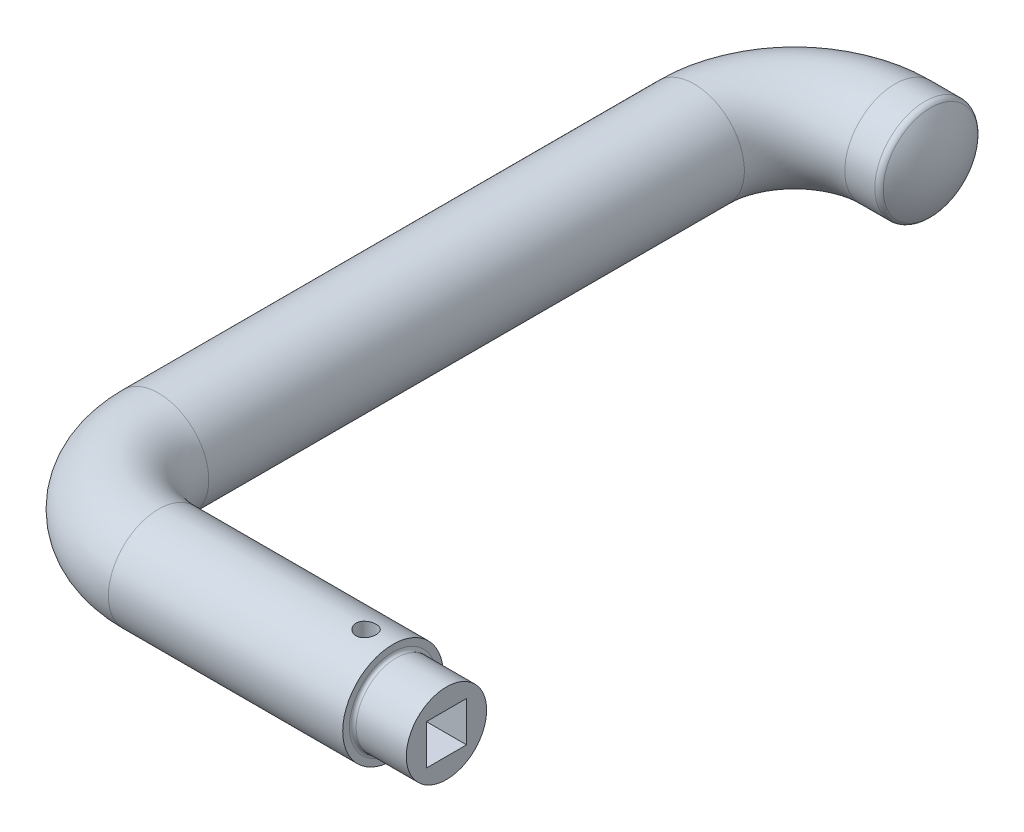
ISO-10303-21;
HEADER;
FILE_DESCRIPTION(('STEP AP214'),'2;1');
FILE_NAME('part.step','',(''),(''),'','','');
FILE_SCHEMA(('AUTOMOTIVE_DESIGN { 1 0 10303 214 1 1 1 1 }'));
ENDSEC;
DATA;
#1=APPLICATION_CONTEXT('core data for automotive mechanical design processes');
#2=APPLICATION_PROTOCOL_DEFINITION('international standard','automotive_design',2000,#1);
#3=PRODUCT_CONTEXT('',#1,'mechanical');
#4=PRODUCT('Part','Part','',(#3));
#5=PRODUCT_RELATED_PRODUCT_CATEGORY('part','',(#4));
#6=PRODUCT_DEFINITION_FORMATION('','',#4);
#7=PRODUCT_DEFINITION_CONTEXT('part definition',#1,'design');
#8=PRODUCT_DEFINITION('design','',#6,#7);
#9=PRODUCT_DEFINITION_SHAPE('','',#8);
#10=(LENGTH_UNIT() NAMED_UNIT(*) SI_UNIT(.MILLI.,.METRE.));
#11=(NAMED_UNIT(*) PLANE_ANGLE_UNIT() SI_UNIT($,.RADIAN.));
#12=(NAMED_UNIT(*) SI_UNIT($,.STERADIAN.) SOLID_ANGLE_UNIT());
#13=UNCERTAINTY_MEASURE_WITH_UNIT(LENGTH_MEASURE(1.E-05),#10,'distance_accuracy_value','');
#14=(GEOMETRIC_REPRESENTATION_CONTEXT(3) GLOBAL_UNCERTAINTY_ASSIGNED_CONTEXT((#13)) GLOBAL_UNIT_ASSIGNED_CONTEXT((#10,
#11,#12)) REPRESENTATION_CONTEXT('',''));
#15=CARTESIAN_POINT('',(0.,0.,0.));
#16=DIRECTION('',(0.,0.,1.));
#17=DIRECTION('',(1.,0.,0.));
#18=AXIS2_PLACEMENT_3D('',#15,#16,#17);
#19=CARTESIAN_POINT('',(0.,0.,0.));
#20=DIRECTION('',(-1.,0.,0.));
#21=DIRECTION('',(0.,0.,1.));
#22=AXIS2_PLACEMENT_3D('',#19,#20,#21);
#23=CYLINDRICAL_SURFACE('',#22,7.49999999999999);
#24=CARTESIAN_POINT('',(-26.9999999999999,0.,0.));
#25=DIRECTION('',(1.,0.,0.));
#26=DIRECTION('',(0.,0.,-1.));
#27=AXIS2_PLACEMENT_3D('',#24,#25,#26);
#28=CIRCLE('',#27,7.49999999999999);
#29=CARTESIAN_POINT('',(-26.9999999999998,0.,7.49999999999999));
#30=VERTEX_POINT('',#29);
#31=EDGE_CURVE('E138',#30,#30,#28,.T.);
#32=ORIENTED_EDGE('',*,*,#31,.T.);
#33=EDGE_LOOP('',(#32));
#34=FACE_BOUND('',#33,.T.);
#35=CARTESIAN_POINT('',(8.00000000000001,0.,0.));
#36=DIRECTION('',(-1.,0.,0.));
#37=DIRECTION('',(0.,0.,1.));
#38=AXIS2_PLACEMENT_3D('',#35,#36,#37);
#39=CIRCLE('',#38,7.49999999999999);
#40=CARTESIAN_POINT('',(8.00000000000001,0.,7.49999999999999));
#41=VERTEX_POINT('',#40);
#42=EDGE_CURVE('E117',#41,#41,#39,.T.);
#43=ORIENTED_EDGE('',*,*,#42,.T.);
#44=EDGE_LOOP('',(#43));
#45=FACE_BOUND('',#44,.T.);
#46=CARTESIAN_POINT('',(2.50000000000001,7.49999999999999,0.));
#47=CARTESIAN_POINT('',(2.50000306674753,7.49999846371306,0.0833653601889495));
#48=CARTESIAN_POINT('',(2.50697326445148,7.49859577767346,0.166769490302283));
#49=CARTESIAN_POINT('',(2.53464775017288,7.49313548434846,0.331220261533529));
#50=CARTESIAN_POINT('',(2.55536294920227,7.48907576790279,0.412264976312033));
#51=CARTESIAN_POINT('',(2.60986191043119,7.47875473917429,0.569595457894969));
#52=CARTESIAN_POINT('',(2.64363315526704,7.47249553615076,0.645885701899701));
#53=CARTESIAN_POINT('',(2.72324837126695,7.45845597052971,0.791711983296338));
#54=CARTESIAN_POINT('',(2.76909162341082,7.4506756985356,0.861248422613717));
#55=CARTESIAN_POINT('',(2.87220774143716,7.43433247994954,0.992540215972297));
#56=CARTESIAN_POINT('',(2.92961253308681,7.4257611825652,1.05419092673779));
#57=CARTESIAN_POINT('',(3.05393862458756,7.40886270678882,1.16705513491204));
#58=CARTESIAN_POINT('',(3.12086066700269,7.40053554750635,1.21826781715564));
#59=CARTESIAN_POINT('',(3.26307428951782,7.38498662718922,1.30924763002143));
#60=CARTESIAN_POINT('',(3.33843646569455,7.37777561047418,1.3489064082988));
#61=CARTESIAN_POINT('',(3.49492272850613,7.36539402087626,1.41495849987046));
#62=CARTESIAN_POINT('',(3.57604624501953,7.36022324642942,1.44135312365586));
#63=CARTESIAN_POINT('',(3.74062654586189,7.35259207878306,1.47978794982724));
#64=CARTESIAN_POINT('',(3.82403881621335,7.35009705160781,1.49201174693817));
#65=CARTESIAN_POINT('',(3.99176473204652,7.3479956259094,1.50232819158918));
#66=CARTESIAN_POINT('',(4.07607828448023,7.3483889320176,1.50042228407025));
#67=CARTESIAN_POINT('',(4.24187018203151,7.35198826722276,1.48268185965273));
#68=CARTESIAN_POINT('',(4.32337210844098,7.35515179288145,1.46705781036586));
#69=CARTESIAN_POINT('',(4.48257411499451,7.36386819240001,1.42265682693458));
#70=CARTESIAN_POINT('',(4.56027401337852,7.36942118036667,1.39387926465102));
#71=CARTESIAN_POINT('',(4.71027289255541,7.38233427750611,1.32378717551208));
#72=CARTESIAN_POINT('',(4.78253181935377,7.38970634720556,1.28238922684817));
#73=CARTESIAN_POINT('',(4.91915627495923,7.40541928159592,1.18829036185902));
#74=CARTESIAN_POINT('',(4.98352089527674,7.41376025757548,1.13558814653524));
#75=CARTESIAN_POINT('',(5.10374410368541,7.43065531862192,1.01924990184088));
#76=CARTESIAN_POINT('',(5.1594288517887,7.43921053816357,0.955434241818667));
#77=CARTESIAN_POINT('',(5.25933076945184,7.45543273071612,0.819277536093014));
#78=CARTESIAN_POINT('',(5.30354779194038,7.4630996923346,0.746936381069083));
#79=CARTESIAN_POINT('',(5.37929126383897,7.4767003524133,0.59558908031838));
#80=CARTESIAN_POINT('',(5.41079784046681,7.48263133272407,0.516572729377949));
#81=CARTESIAN_POINT('',(5.46004071105786,7.49207113481787,0.354223464672997));
#82=CARTESIAN_POINT('',(5.47777867311045,7.49558025000796,0.270891075108674));
#83=CARTESIAN_POINT('',(5.49873468069142,7.49974007800301,0.103769108440725));
#84=CARTESIAN_POINT('',(5.50219062931041,7.50043761978704,0.0200104924883638));
#85=CARTESIAN_POINT('',(5.49512521158674,7.49902577895153,-0.146887401289071));
#86=CARTESIAN_POINT('',(5.48460463097111,7.49691655412168,-0.23002671366569));
#87=CARTESIAN_POINT('',(5.45008243968408,7.49015748012026,-0.392558489919811));
#88=CARTESIAN_POINT('',(5.42620289725315,7.48553064606309,-0.471977922509854));
#89=CARTESIAN_POINT('',(5.36577402601629,7.47425328091548,-0.6256854412495));
#90=CARTESIAN_POINT('',(5.32922374798476,7.46760259821339,-0.699973142456309));
#91=CARTESIAN_POINT('',(5.24397626402304,7.45289867299941,-0.842311760529326));
#92=CARTESIAN_POINT('',(5.19513582844159,7.44482925655577,-0.910275190128281));
#93=CARTESIAN_POINT('',(5.08688621318909,7.42822102244823,-1.03712702867881));
#94=CARTESIAN_POINT('',(5.02747590040021,7.41968215452581,-1.09601446339614));
#95=CARTESIAN_POINT('',(4.89868997216332,7.40293955335447,-1.20396088616126));
#96=CARTESIAN_POINT('',(4.829176383668,7.39474290349956,-1.25285655367298));
#97=CARTESIAN_POINT('',(4.68278295796499,7.37976287694291,-1.33827813007681));
#98=CARTESIAN_POINT('',(4.60590341563968,7.37297944370013,-1.37480453388435));
#99=CARTESIAN_POINT('',(4.44734763077568,7.36165110876574,-1.43422776237294));
#100=CARTESIAN_POINT('',(4.36569873818453,7.35709462308279,-1.45719524968658));
#101=CARTESIAN_POINT('',(4.19959981976365,7.35071155188037,-1.48906297744079));
#102=CARTESIAN_POINT('',(4.11515016068599,7.34888461036666,-1.49796505233767));
#103=CARTESIAN_POINT('',(3.94748670318353,7.34818724447068,-1.5013813663012));
#104=CARTESIAN_POINT('',(3.86427827660949,7.34926378783951,-1.49615368210634));
#105=CARTESIAN_POINT('',(3.69995252514247,7.3541336022692,-1.47202845615009));
#106=CARTESIAN_POINT('',(3.6188351834578,7.35792685150753,-1.45313102419395));
#107=CARTESIAN_POINT('',(3.46115843313919,7.36777896328737,-1.40231785274843));
#108=CARTESIAN_POINT('',(3.38458845924639,7.37383231528245,-1.37043376007602));
#109=CARTESIAN_POINT('',(3.23784441889835,7.38752572461255,-1.29458196690241));
#110=CARTESIAN_POINT('',(3.1676708894123,7.3951659149834,-1.25061325316232));
#111=CARTESIAN_POINT('',(3.03442664177454,7.41133440784837,-1.15095887217962));
#112=CARTESIAN_POINT('',(2.97149685209862,7.41987559364548,-1.09508683085277));
#113=CARTESIAN_POINT('',(2.85582069170625,7.43679122807931,-0.973596553519711));
#114=CARTESIAN_POINT('',(2.8030766645241,7.44516563794776,-0.907976080730002));
#115=CARTESIAN_POINT('',(2.70874803408034,7.46090748581956,-0.76802644363237));
#116=CARTESIAN_POINT('',(2.66728599507997,7.46826346828869,-0.693613326644752));
#117=CARTESIAN_POINT('',(2.59752081610512,7.48102687627499,-0.538749541411098));
#118=CARTESIAN_POINT('',(2.56920581570127,7.48643605707923,-0.458304391294689));
#119=CARTESIAN_POINT('',(2.53202207793294,7.49364558893055,-0.314732233385669));
#120=CARTESIAN_POINT('',(2.52003520943837,7.49601454737677,-0.252422496020677));
#121=CARTESIAN_POINT('',(2.50402313146246,7.49919231209838,-0.1267492878151));
#122=CARTESIAN_POINT('',(2.49999766823536,7.50000116809732,-0.0633858506229287));
#123=CARTESIAN_POINT('',(2.50000000000001,7.49999999999999,0.));
#124=B_SPLINE_CURVE_WITH_KNOTS('',3,(#46,#47,#48,#49,#50,#51,#52,#53,#54,#55,#56,#57,#58,#59,
#60,#61,#62,#63,#64,#65,#66,#67,#68,#69,#70,#71,#72,#73,#74,#75,#76,#77,#78,#79,#80,#81,#82,#83,
#84,#85,#86,#87,#88,#89,#90,#91,#92,#93,#94,#95,#96,#97,#98,#99,#100,#101,#102,#103,#104,#105,
#106,#107,#108,#109,#110,#111,#112,#113,#114,#115,#116,#117,#118,#119,#120,#121,#122,#123),
.UNSPECIFIED.,.T.,.F.,(4,2,2,2,2,2,2,2,2,2,2,2,2,2,2,2,2,2,2,2,2,2,2,2,2,2,2,2,2,2,2,2,2,2,2,2,
2,2,4),(0.,0.249864195991888,0.499926976036984,0.749750602875512,0.999559353346294,
1.25239900516828,1.50525839512105,1.76041792508884,2.01555224047796,2.26734277655381,
2.51910756421838,2.76707590509417,3.01505608880595,3.26471235305389,3.51439732124506,
3.76857378737026,4.0227535130973,4.27732912281036,4.53187388547054,4.78216103514398,
5.03243411486801,5.28045680926085,5.52849808824033,5.77957599050038,6.03068082518895,
6.28560942868838,6.540527830852,6.79410571549084,7.04765052495622,7.29659583851552,
7.54553915238912,7.79387941879665,8.04224051372799,8.29482114358714,8.54745981799396,
8.80274245013455,9.05779433276278,9.24778162934841,9.43776287056494),.UNSPECIFIED.);
#125=CARTESIAN_POINT('',(2.50000000000001,7.49999999999999,0.));
#126=VERTEX_POINT('',#125);
#127=EDGE_CURVE('E98',#126,#126,#124,.T.);
#128=ORIENTED_EDGE('',*,*,#127,.F.);
#129=EDGE_LOOP('',(#128));
#130=FACE_BOUND('',#129,.T.);
#131=ADVANCED_FACE('F45',(#34,#45,#130),#23,.T.);
#132=CARTESIAN_POINT('',(-27.,0.,-15.));
#133=DIRECTION('',(0.,-1.,0.));
#134=DIRECTION('',(0.,0.,-1.));
#135=AXIS2_PLACEMENT_3D('',#132,#133,#134);
#136=TOROIDAL_SURFACE('',#135,15.,7.49999999999999);
#137=CARTESIAN_POINT('',(-42.,0.,-15.0000000000001));
#138=DIRECTION('',(0.,0.,1.));
#139=DIRECTION('',(1.,0.,0.));
#140=AXIS2_PLACEMENT_3D('',#137,#138,#139);
#141=CIRCLE('',#140,7.49999999999999);
#142=CARTESIAN_POINT('',(-49.5,0.,-15.0000000000002));
#143=VERTEX_POINT('',#142);
#144=EDGE_CURVE('E141',#143,#143,#141,.T.);
#145=CARTESIAN_POINT('',(-27.,0.,-15.));
#146=DIRECTION('',(0.,-1.,0.));
#147=DIRECTION('',(0.,0.,-1.));
#148=AXIS2_PLACEMENT_3D('',#145,#146,#147);
#149=CIRCLE('',#148,22.5);
#150=EDGE_CURVE('',#30,#143,#149,.T.);
#151=ORIENTED_EDGE('',*,*,#31,.F.);
#152=ORIENTED_EDGE('',*,*,#144,.T.);
#153=ORIENTED_EDGE('',*,*,#150,.T.);
#154=ORIENTED_EDGE('',*,*,#150,.F.);
#155=EDGE_LOOP('',(#151,#153,#152,#154));
#156=FACE_BOUND('',#155,.T.);
#157=ADVANCED_FACE('F184',(#156),#136,.T.);
#158=CARTESIAN_POINT('',(-42.,0.,-15.0000000000001));
#159=DIRECTION('',(0.,0.,-1.));
#160=DIRECTION('',(-1.,0.,0.));
#161=AXIS2_PLACEMENT_3D('',#158,#159,#160);
#162=CYLINDRICAL_SURFACE('',#161,7.49999999999999);
#163=CARTESIAN_POINT('',(-42.,0.,-94.9999999999999));
#164=DIRECTION('',(0.,0.,1.));
#165=DIRECTION('',(1.,0.,0.));
#166=AXIS2_PLACEMENT_3D('',#163,#164,#165);
#167=CIRCLE('',#166,7.49999999999999);
#168=CARTESIAN_POINT('',(-49.5,0.,-94.9999999999998));
#169=VERTEX_POINT('',#168);
#170=EDGE_CURVE('E144',#169,#169,#167,.T.);
#171=ORIENTED_EDGE('',*,*,#170,.T.);
#172=EDGE_LOOP('',(#171));
#173=FACE_BOUND('',#172,.T.);
#174=ORIENTED_EDGE('',*,*,#144,.F.);
#175=EDGE_LOOP('',(#174));
#176=FACE_BOUND('',#175,.T.);
#177=ADVANCED_FACE('F190',(#173,#176),#162,.T.);
#178=CARTESIAN_POINT('',(-27.,0.,-95.));
#179=DIRECTION('',(0.,-1.,0.));
#180=DIRECTION('',(0.,0.,-1.));
#181=AXIS2_PLACEMENT_3D('',#178,#179,#180);
#182=TOROIDAL_SURFACE('',#181,15.,7.49999999999999);
#183=CARTESIAN_POINT('',(-27.,0.,-110.));
#184=DIRECTION('',(-1.,0.,0.));
#185=DIRECTION('',(0.,0.,1.));
#186=AXIS2_PLACEMENT_3D('',#183,#184,#185);
#187=CIRCLE('',#186,7.49999999999999);
#188=CARTESIAN_POINT('',(-27.,0.,-117.5));
#189=VERTEX_POINT('',#188);
#190=EDGE_CURVE('E147',#189,#189,#187,.T.);
#191=CARTESIAN_POINT('',(-27.,0.,-95.));
#192=DIRECTION('',(0.,-1.,0.));
#193=DIRECTION('',(0.,0.,-1.));
#194=AXIS2_PLACEMENT_3D('',#191,#192,#193);
#195=CIRCLE('',#194,22.5);
#196=EDGE_CURVE('',#169,#189,#195,.T.);
#197=ORIENTED_EDGE('',*,*,#170,.F.);
#198=ORIENTED_EDGE('',*,*,#190,.T.);
#199=ORIENTED_EDGE('',*,*,#196,.T.);
#200=ORIENTED_EDGE('',*,*,#196,.F.);
#201=EDGE_LOOP('',(#197,#199,#198,#200));
#202=FACE_BOUND('',#201,.T.);
#203=ADVANCED_FACE('F198',(#202),#182,.T.);
#204=CARTESIAN_POINT('',(-27.,0.,-110.));
#205=DIRECTION('',(1.,0.,0.));
#206=DIRECTION('',(0.,0.,-1.));
#207=AXIS2_PLACEMENT_3D('',#204,#205,#206);
#208=CYLINDRICAL_SURFACE('',#207,7.49999999999999);
#209=CARTESIAN_POINT('',(-22.5131670194949,0.,-110.));
#210=DIRECTION('',(-1.,0.,0.));
#211=DIRECTION('',(0.,0.,1.));
#212=AXIS2_PLACEMENT_3D('',#209,#210,#211);
#213=CIRCLE('',#212,7.49999999999999);
#214=CARTESIAN_POINT('',(-22.5131670194949,0.,-102.5));
#215=VERTEX_POINT('',#214);
#216=EDGE_CURVE('E53',#215,#215,#213,.T.);
#217=ORIENTED_EDGE('',*,*,#216,.T.);
#218=EDGE_LOOP('',(#217));
#219=FACE_BOUND('',#218,.T.);
#220=ORIENTED_EDGE('',*,*,#190,.F.);
#221=EDGE_LOOP('',(#220));
#222=FACE_BOUND('',#221,.T.);
#223=ADVANCED_FACE('F170',(#219,#222),#208,.T.);
#224=CARTESIAN_POINT('',(-32.,0.,-110.));
#225=DIRECTION('',(-1.,0.,0.));
#226=DIRECTION('',(0.,0.,-1.));
#227=AXIS2_PLACEMENT_3D('',#224,#225,#226);
#228=SPHERICAL_SURFACE('',#227,12.5);
#229=CARTESIAN_POINT('',(-21.6882250211901,0.,-110.));
#230=DIRECTION('',(-1.,0.,0.));
#231=DIRECTION('',(0.,0.,1.));
#232=AXIS2_PLACEMENT_3D('',#229,#230,#231);
#233=CIRCLE('',#232,7.06521739130434);
#234=CARTESIAN_POINT('',(-21.6882250211901,0.,-102.934782608696));
#235=VERTEX_POINT('',#234);
#236=EDGE_CURVE('E12',#235,#235,#233,.F.);
#237=ORIENTED_EDGE('',*,*,#236,.T.);
#238=EDGE_LOOP('',(#237));
#239=FACE_BOUND('',#238,.T.);
#240=ADVANCED_FACE('F193',(#239),#228,.T.);
#241=CARTESIAN_POINT('',(8.00000000000001,0.,-7.49999999999999));
#242=DIRECTION('',(-1.,0.,0.));
#243=DIRECTION('',(0.,0.,1.));
#244=AXIS2_PLACEMENT_3D('',#241,#242,#243);
#245=PLANE('',#244);
#246=CARTESIAN_POINT('',(8.00000000000001,0.,0.));
#247=DIRECTION('',(-1.,0.,0.));
#248=DIRECTION('',(0.,0.,1.));
#249=AXIS2_PLACEMENT_3D('',#246,#247,#248);
#250=CIRCLE('',#249,6.5);
#251=CARTESIAN_POINT('',(8.00000000000001,0.,6.5));
#252=VERTEX_POINT('',#251);
#253=EDGE_CURVE('E159',#252,#252,#250,.T.);
#254=ORIENTED_EDGE('',*,*,#253,.T.);
#255=EDGE_LOOP('',(#254));
#256=FACE_BOUND('',#255,.T.);
#257=ORIENTED_EDGE('',*,*,#42,.F.);
#258=EDGE_LOOP('',(#257));
#259=FACE_BOUND('',#258,.T.);
#260=ADVANCED_FACE('F204',(#256,#259),#245,.F.);
#261=CARTESIAN_POINT('',(0.,0.,0.));
#262=DIRECTION('',(-1.,0.,0.));
#263=DIRECTION('',(0.,0.,1.));
#264=AXIS2_PLACEMENT_3D('',#261,#262,#263);
#265=CYLINDRICAL_SURFACE('',#264,6.);
#266=CARTESIAN_POINT('',(8.50000000000001,0.,0.));
#267=DIRECTION('',(-1.,0.,0.));
#268=DIRECTION('',(0.,0.,1.));
#269=AXIS2_PLACEMENT_3D('',#266,#267,#268);
#270=CIRCLE('',#269,6.);
#271=CARTESIAN_POINT('',(8.50000000000001,0.,6.));
#272=VERTEX_POINT('',#271);
#273=EDGE_CURVE('E162',#272,#272,#270,.F.);
#274=ORIENTED_EDGE('',*,*,#273,.T.);
#275=EDGE_LOOP('',(#274));
#276=FACE_BOUND('',#275,.T.);
#277=CARTESIAN_POINT('',(16.,0.,0.));
#278=DIRECTION('',(-1.,0.,0.));
#279=DIRECTION('',(0.,0.,1.));
#280=AXIS2_PLACEMENT_3D('',#277,#278,#279);
#281=CIRCLE('',#280,6.);
#282=CARTESIAN_POINT('',(16.,0.,6.));
#283=VERTEX_POINT('',#282);
#284=EDGE_CURVE('E93',#283,#283,#281,.T.);
#285=ORIENTED_EDGE('',*,*,#284,.T.);
#286=EDGE_LOOP('',(#285));
#287=FACE_BOUND('',#286,.T.);
#288=ADVANCED_FACE('F223',(#276,#287),#265,.T.);
#289=CARTESIAN_POINT('',(16.,0.,-6.));
#290=DIRECTION('',(-1.,0.,0.));
#291=DIRECTION('',(0.,0.,1.));
#292=AXIS2_PLACEMENT_3D('',#289,#290,#291);
#293=PLANE('',#292);
#294=ORIENTED_EDGE('',*,*,#284,.F.);
#295=EDGE_LOOP('',(#294));
#296=FACE_BOUND('',#295,.T.);
#297=DIRECTION('',(0.,0.,1.));
#298=VECTOR('',#297,1.);
#299=CARTESIAN_POINT('',(16.,-3.,-6.));
#300=LINE('',#299,#298);
#301=CARTESIAN_POINT('',(16.,-3.,-3.));
#302=VERTEX_POINT('',#301);
#303=CARTESIAN_POINT('',(16.,-3.,3.));
#304=VERTEX_POINT('',#303);
#305=EDGE_CURVE('E150',#302,#304,#300,.T.);
#306=ORIENTED_EDGE('',*,*,#305,.T.);
#307=DIRECTION('',(0.,1.,0.));
#308=VECTOR('',#307,1.);
#309=CARTESIAN_POINT('',(16.,0.,3.));
#310=LINE('',#309,#308);
#311=CARTESIAN_POINT('',(16.,3.,3.));
#312=VERTEX_POINT('',#311);
#313=EDGE_CURVE('E68',#304,#312,#310,.T.);
#314=ORIENTED_EDGE('',*,*,#313,.T.);
#315=DIRECTION('',(0.,0.,-1.));
#316=VECTOR('',#315,1.);
#317=CARTESIAN_POINT('',(16.,3.,-6.));
#318=LINE('',#317,#316);
#319=CARTESIAN_POINT('',(16.,3.,-3.));
#320=VERTEX_POINT('',#319);
#321=EDGE_CURVE('E155',#312,#320,#318,.T.);
#322=ORIENTED_EDGE('',*,*,#321,.T.);
#323=DIRECTION('',(0.,-1.,0.));
#324=VECTOR('',#323,1.);
#325=CARTESIAN_POINT('',(16.,0.,-3.));
#326=LINE('',#325,#324);
#327=EDGE_CURVE('E152',#320,#302,#326,.T.);
#328=ORIENTED_EDGE('',*,*,#327,.T.);
#329=EDGE_LOOP('',(#306,#314,#322,#328));
#330=FACE_BOUND('',#329,.T.);
#331=ADVANCED_FACE('F249',(#296,#330),#293,.F.);
#332=CARTESIAN_POINT('',(-8.48528137423857,3.,3.));
#333=DIRECTION('',(0.,0.,1.));
#334=DIRECTION('',(0.,-1.,0.));
#335=AXIS2_PLACEMENT_3D('',#332,#333,#334);
#336=PLANE('',#335);
#337=DIRECTION('',(0.,1.,0.));
#338=VECTOR('',#337,1.);
#339=CARTESIAN_POINT('',(0.,3.,3.));
#340=LINE('',#339,#338);
#341=CARTESIAN_POINT('',(0.,-3.,3.));
#342=VERTEX_POINT('',#341);
#343=CARTESIAN_POINT('',(0.,3.,3.));
#344=VERTEX_POINT('',#343);
#345=EDGE_CURVE('E94',#342,#344,#340,.T.);
#346=ORIENTED_EDGE('',*,*,#345,.T.);
#347=DIRECTION('',(1.,0.,0.));
#348=VECTOR('',#347,1.);
#349=CARTESIAN_POINT('',(-8.48528137423857,3.,3.));
#350=LINE('',#349,#348);
#351=EDGE_CURVE('E109',#344,#312,#350,.T.);
#352=ORIENTED_EDGE('',*,*,#351,.T.);
#353=ORIENTED_EDGE('',*,*,#313,.F.);
#354=DIRECTION('',(1.,0.,0.));
#355=VECTOR('',#354,1.);
#356=CARTESIAN_POINT('',(-8.48528137423857,-3.,3.));
#357=LINE('',#356,#355);
#358=EDGE_CURVE('E88',#342,#304,#357,.T.);
#359=ORIENTED_EDGE('',*,*,#358,.F.);
#360=EDGE_LOOP('',(#346,#352,#353,#359));
#361=FACE_BOUND('',#360,.T.);
#362=ADVANCED_FACE('F96',(#361),#336,.F.);
#363=CARTESIAN_POINT('',(-8.48528137423857,3.,-3.));
#364=DIRECTION('',(0.,1.,0.));
#365=DIRECTION('',(0.,0.,1.));
#366=AXIS2_PLACEMENT_3D('',#363,#364,#365);
#367=PLANE('',#366);
#368=CARTESIAN_POINT('',(4.00000000000001,3.,0.));
#369=DIRECTION('',(0.,1.,0.));
#370=DIRECTION('',(0.,0.,1.));
#371=AXIS2_PLACEMENT_3D('',#368,#369,#370);
#372=CIRCLE('',#371,1.5);
#373=CARTESIAN_POINT('',(4.00000000000001,3.,1.5));
#374=VERTEX_POINT('',#373);
#375=EDGE_CURVE('E165',#374,#374,#372,.F.);
#376=ORIENTED_EDGE('',*,*,#375,.F.);
#377=EDGE_LOOP('',(#376));
#378=FACE_BOUND('',#377,.T.);
#379=DIRECTION('',(0.,0.,-1.));
#380=VECTOR('',#379,1.);
#381=CARTESIAN_POINT('',(0.,3.,-3.));
#382=LINE('',#381,#380);
#383=CARTESIAN_POINT('',(0.,3.,-3.));
#384=VERTEX_POINT('',#383);
#385=EDGE_CURVE('E103',#344,#384,#382,.T.);
#386=ORIENTED_EDGE('',*,*,#385,.T.);
#387=DIRECTION('',(1.,0.,0.));
#388=VECTOR('',#387,1.);
#389=CARTESIAN_POINT('',(-8.48528137423857,3.,-3.));
#390=LINE('',#389,#388);
#391=EDGE_CURVE('E111',#384,#320,#390,.T.);
#392=ORIENTED_EDGE('',*,*,#391,.T.);
#393=ORIENTED_EDGE('',*,*,#321,.F.);
#394=ORIENTED_EDGE('',*,*,#351,.F.);
#395=EDGE_LOOP('',(#386,#392,#393,#394));
#396=FACE_BOUND('',#395,.T.);
#397=ADVANCED_FACE('F236',(#378,#396),#367,.F.);
#398=CARTESIAN_POINT('',(-8.48528137423857,3.,-3.));
#399=DIRECTION('',(0.,0.,-1.));
#400=DIRECTION('',(0.,1.,0.));
#401=AXIS2_PLACEMENT_3D('',#398,#399,#400);
#402=PLANE('',#401);
#403=DIRECTION('',(0.,-1.,0.));
#404=VECTOR('',#403,1.);
#405=CARTESIAN_POINT('',(0.,3.,-3.));
#406=LINE('',#405,#404);
#407=CARTESIAN_POINT('',(0.,-3.,-3.));
#408=VERTEX_POINT('',#407);
#409=EDGE_CURVE('E105',#384,#408,#406,.T.);
#410=ORIENTED_EDGE('',*,*,#409,.T.);
#411=DIRECTION('',(1.,0.,0.));
#412=VECTOR('',#411,1.);
#413=CARTESIAN_POINT('',(-8.48528137423857,-3.,-3.));
#414=LINE('',#413,#412);
#415=EDGE_CURVE('E60',#408,#302,#414,.T.);
#416=ORIENTED_EDGE('',*,*,#415,.T.);
#417=ORIENTED_EDGE('',*,*,#327,.F.);
#418=ORIENTED_EDGE('',*,*,#391,.F.);
#419=EDGE_LOOP('',(#410,#416,#417,#418));
#420=FACE_BOUND('',#419,.T.);
#421=ADVANCED_FACE('F239',(#420),#402,.F.);
#422=CARTESIAN_POINT('',(-8.48528137423857,-3.,-3.));
#423=DIRECTION('',(0.,-1.,0.));
#424=DIRECTION('',(0.,0.,-1.));
#425=AXIS2_PLACEMENT_3D('',#422,#423,#424);
#426=PLANE('',#425);
#427=DIRECTION('',(0.,0.,1.));
#428=VECTOR('',#427,1.);
#429=CARTESIAN_POINT('',(0.,-3.,-3.));
#430=LINE('',#429,#428);
#431=EDGE_CURVE('E86',#408,#342,#430,.T.);
#432=ORIENTED_EDGE('',*,*,#431,.T.);
#433=ORIENTED_EDGE('',*,*,#358,.T.);
#434=ORIENTED_EDGE('',*,*,#305,.F.);
#435=ORIENTED_EDGE('',*,*,#415,.F.);
#436=EDGE_LOOP('',(#432,#433,#434,#435));
#437=FACE_BOUND('',#436,.T.);
#438=ADVANCED_FACE('F87',(#437),#426,.F.);
#439=CARTESIAN_POINT('',(-22.,0.,-117.5));
#440=DIRECTION('',(1.,0.,0.));
#441=DIRECTION('',(0.,0.,-1.));
#442=AXIS2_PLACEMENT_3D('',#439,#440,#441);
#443=PLANE('',#442);
#444=CARTESIAN_POINT('',(-22.,0.,-110.));
#445=DIRECTION('',(-1.,0.,0.));
#446=DIRECTION('',(0.,0.,1.));
#447=AXIS2_PLACEMENT_3D('',#444,#445,#446);
#448=CIRCLE('',#447,5.99999999999999);
#449=CARTESIAN_POINT('',(-22.,0.,-104.));
#450=VERTEX_POINT('',#449);
#451=EDGE_CURVE('E133',#450,#450,#448,.T.);
#452=ORIENTED_EDGE('',*,*,#451,.T.);
#453=EDGE_LOOP('',(#452));
#454=FACE_BOUND('',#453,.T.);
#455=ADVANCED_FACE('F246',(#454),#443,.F.);
#456=CARTESIAN_POINT('',(-27.,0.,-110.));
#457=DIRECTION('',(1.,0.,0.));
#458=DIRECTION('',(0.,0.,-1.));
#459=AXIS2_PLACEMENT_3D('',#456,#457,#458);
#460=CYLINDRICAL_SURFACE('',#459,5.99999999999999);
#461=ORIENTED_EDGE('',*,*,#451,.F.);
#462=EDGE_LOOP('',(#461));
#463=FACE_BOUND('',#462,.T.);
#464=CARTESIAN_POINT('',(-27.,0.,-110.));
#465=DIRECTION('',(-1.,0.,0.));
#466=DIRECTION('',(0.,0.,1.));
#467=AXIS2_PLACEMENT_3D('',#464,#465,#466);
#468=CIRCLE('',#467,5.99999999999999);
#469=CARTESIAN_POINT('',(-27.,0.,-116.));
#470=VERTEX_POINT('',#469);
#471=EDGE_CURVE('E130',#470,#470,#468,.T.);
#472=ORIENTED_EDGE('',*,*,#471,.T.);
#473=EDGE_LOOP('',(#472));
#474=FACE_BOUND('',#473,.T.);
#475=ADVANCED_FACE('F257',(#463,#474),#460,.F.);
#476=CARTESIAN_POINT('',(-27.,0.,-95.));
#477=DIRECTION('',(0.,-1.,0.));
#478=DIRECTION('',(0.,0.,-1.));
#479=AXIS2_PLACEMENT_3D('',#476,#477,#478);
#480=TOROIDAL_SURFACE('',#479,15.,5.99999999999999);
#481=CARTESIAN_POINT('',(-42.,0.,-94.9999999999999));
#482=DIRECTION('',(0.,0.,-1.));
#483=DIRECTION('',(-1.,0.,0.));
#484=AXIS2_PLACEMENT_3D('',#481,#482,#483);
#485=CIRCLE('',#484,5.99999999999999);
#486=CARTESIAN_POINT('',(-48.,0.,-94.9999999999998));
#487=VERTEX_POINT('',#486);
#488=EDGE_CURVE('E127',#487,#487,#485,.F.);
#489=CARTESIAN_POINT('',(-27.,0.,-95.));
#490=DIRECTION('',(0.,-1.,0.));
#491=DIRECTION('',(0.,0.,-1.));
#492=AXIS2_PLACEMENT_3D('',#489,#490,#491);
#493=CIRCLE('',#492,21.);
#494=EDGE_CURVE('',#487,#470,#493,.T.);
#495=ORIENTED_EDGE('',*,*,#488,.T.);
#496=ORIENTED_EDGE('',*,*,#471,.F.);
#497=ORIENTED_EDGE('',*,*,#494,.T.);
#498=ORIENTED_EDGE('',*,*,#494,.F.);
#499=EDGE_LOOP('',(#495,#497,#496,#498));
#500=FACE_BOUND('',#499,.T.);
#501=ADVANCED_FACE('F270',(#500),#480,.F.);
#502=CARTESIAN_POINT('',(-42.,0.,-15.0000000000001));
#503=DIRECTION('',(0.,0.,-1.));
#504=DIRECTION('',(-1.,0.,0.));
#505=AXIS2_PLACEMENT_3D('',#502,#503,#504);
#506=CYLINDRICAL_SURFACE('',#505,5.99999999999999);
#507=ORIENTED_EDGE('',*,*,#488,.F.);
#508=EDGE_LOOP('',(#507));
#509=FACE_BOUND('',#508,.T.);
#510=CARTESIAN_POINT('',(-42.,0.,-15.0000000000001));
#511=DIRECTION('',(0.,0.,1.));
#512=DIRECTION('',(1.,0.,0.));
#513=AXIS2_PLACEMENT_3D('',#510,#511,#512);
#514=CIRCLE('',#513,5.99999999999999);
#515=CARTESIAN_POINT('',(-48.,0.,-15.0000000000001));
#516=VERTEX_POINT('',#515);
#517=EDGE_CURVE('E124',#516,#516,#514,.T.);
#518=ORIENTED_EDGE('',*,*,#517,.T.);
#519=EDGE_LOOP('',(#518));
#520=FACE_BOUND('',#519,.T.);
#521=ADVANCED_FACE('F266',(#509,#520),#506,.F.);
#522=CARTESIAN_POINT('',(-27.,0.,-15.));
#523=DIRECTION('',(0.,-1.,0.));
#524=DIRECTION('',(0.,0.,-1.));
#525=AXIS2_PLACEMENT_3D('',#522,#523,#524);
#526=TOROIDAL_SURFACE('',#525,15.,5.99999999999999);
#527=CARTESIAN_POINT('',(-26.9999999999999,0.,0.));
#528=DIRECTION('',(-1.,0.,0.));
#529=DIRECTION('',(0.,0.,1.));
#530=AXIS2_PLACEMENT_3D('',#527,#528,#529);
#531=CIRCLE('',#530,5.99999999999999);
#532=CARTESIAN_POINT('',(-26.9999999999998,0.,5.99999999999999));
#533=VERTEX_POINT('',#532);
#534=EDGE_CURVE('E121',#533,#533,#531,.F.);
#535=CARTESIAN_POINT('',(-27.,0.,-15.));
#536=DIRECTION('',(0.,-1.,0.));
#537=DIRECTION('',(0.,0.,-1.));
#538=AXIS2_PLACEMENT_3D('',#535,#536,#537);
#539=CIRCLE('',#538,21.);
#540=EDGE_CURVE('',#533,#516,#539,.T.);
#541=ORIENTED_EDGE('',*,*,#534,.T.);
#542=ORIENTED_EDGE('',*,*,#517,.F.);
#543=ORIENTED_EDGE('',*,*,#540,.T.);
#544=ORIENTED_EDGE('',*,*,#540,.F.);
#545=EDGE_LOOP('',(#541,#543,#542,#544));
#546=FACE_BOUND('',#545,.T.);
#547=ADVANCED_FACE('F262',(#546),#526,.F.);
#548=CARTESIAN_POINT('',(0.,0.,0.));
#549=DIRECTION('',(-1.,0.,0.));
#550=DIRECTION('',(0.,0.,1.));
#551=AXIS2_PLACEMENT_3D('',#548,#549,#550);
#552=CYLINDRICAL_SURFACE('',#551,5.99999999999999);
#553=ORIENTED_EDGE('',*,*,#534,.F.);
#554=EDGE_LOOP('',(#553));
#555=FACE_BOUND('',#554,.T.);
#556=CARTESIAN_POINT('',(0.,0.,0.));
#557=DIRECTION('',(1.,0.,0.));
#558=DIRECTION('',(0.,0.,-1.));
#559=AXIS2_PLACEMENT_3D('',#556,#557,#558);
#560=CIRCLE('',#559,5.99999999999999);
#561=CARTESIAN_POINT('',(0.,0.,-5.99999999999999));
#562=VERTEX_POINT('',#561);
#563=EDGE_CURVE('E120',#562,#562,#560,.T.);
#564=ORIENTED_EDGE('',*,*,#563,.T.);
#565=EDGE_LOOP('',(#564));
#566=FACE_BOUND('',#565,.T.);
#567=ADVANCED_FACE('F215',(#555,#566),#552,.F.);
#568=CARTESIAN_POINT('',(0.,0.,-3.));
#569=DIRECTION('',(1.,0.,0.));
#570=DIRECTION('',(0.,0.,-1.));
#571=AXIS2_PLACEMENT_3D('',#568,#569,#570);
#572=PLANE('',#571);
#573=ORIENTED_EDGE('',*,*,#409,.F.);
#574=ORIENTED_EDGE('',*,*,#385,.F.);
#575=ORIENTED_EDGE('',*,*,#345,.F.);
#576=ORIENTED_EDGE('',*,*,#431,.F.);
#577=EDGE_LOOP('',(#573,#574,#575,#576));
#578=FACE_BOUND('',#577,.T.);
#579=ORIENTED_EDGE('',*,*,#563,.F.);
#580=EDGE_LOOP('',(#579));
#581=FACE_BOUND('',#580,.T.);
#582=ADVANCED_FACE('F101',(#578,#581),#572,.F.);
#583=CARTESIAN_POINT('',(8.50000000000001,0.,0.));
#584=DIRECTION('',(-1.,0.,0.));
#585=DIRECTION('',(0.,0.,1.));
#586=AXIS2_PLACEMENT_3D('',#583,#584,#585);
#587=TOROIDAL_SURFACE('',#586,6.5,0.5);
#588=ORIENTED_EDGE('',*,*,#273,.F.);
#589=EDGE_LOOP('',(#588));
#590=FACE_BOUND('',#589,.T.);
#591=ORIENTED_EDGE('',*,*,#253,.F.);
#592=EDGE_LOOP('',(#591));
#593=FACE_BOUND('',#592,.T.);
#594=ADVANCED_FACE('F179',(#590,#593),#587,.F.);
#595=CARTESIAN_POINT('',(4.00000000000001,7.49999999999999,0.));
#596=DIRECTION('',(0.,-1.,0.));
#597=DIRECTION('',(0.,0.,-1.));
#598=AXIS2_PLACEMENT_3D('',#595,#596,#597);
#599=CYLINDRICAL_SURFACE('',#598,1.5);
#600=ORIENTED_EDGE('',*,*,#375,.T.);
#601=EDGE_LOOP('',(#600));
#602=FACE_BOUND('',#601,.T.);
#603=ORIENTED_EDGE('',*,*,#127,.T.);
#604=EDGE_LOOP('',(#603));
#605=FACE_BOUND('',#604,.T.);
#606=ADVANCED_FACE('F174',(#602,#605),#599,.F.);
#607=CARTESIAN_POINT('',(-22.5131670194949,0.,-110.));
#608=DIRECTION('',(-1.,0.,0.));
#609=DIRECTION('',(0.,0.,1.));
#610=AXIS2_PLACEMENT_3D('',#607,#608,#609);
#611=TOROIDAL_SURFACE('',#610,6.49999999999999,1.);
#612=ORIENTED_EDGE('',*,*,#236,.F.);
#613=EDGE_LOOP('',(#612));
#614=FACE_BOUND('',#613,.T.);
#615=ORIENTED_EDGE('',*,*,#216,.F.);
#616=EDGE_LOOP('',(#615));
#617=FACE_BOUND('',#616,.T.);
#618=ADVANCED_FACE('F47',(#614,#617),#611,.T.);
#619=CLOSED_SHELL('',(#131,#157,#177,#203,#223,#240,#260,#288,#331,#362,#397,#421,#438,#455,
#475,#501,#521,#547,#567,#582,#594,#606,#618));
#620=MANIFOLD_SOLID_BREP('B2',#619);
#621=ADVANCED_BREP_SHAPE_REPRESENTATION('',(#18,#620),#14);
#622=SHAPE_DEFINITION_REPRESENTATION(#9,#621);
ENDSEC;
END-ISO-10303-21;
